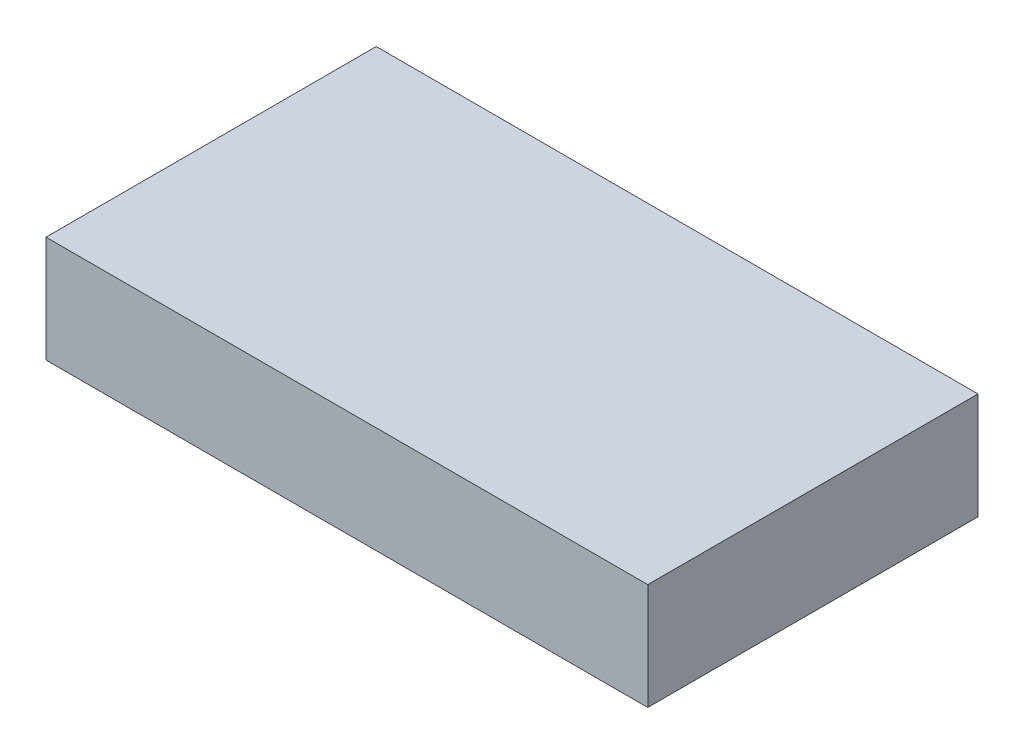
ISO-10303-21;
HEADER;
FILE_DESCRIPTION(('STEP AP214'),'2;1');
FILE_NAME('part.step','',(''),(''),'','','');
FILE_SCHEMA(('AUTOMOTIVE_DESIGN { 1 0 10303 214 1 1 1 1 }'));
ENDSEC;
DATA;
#1=APPLICATION_CONTEXT('core data for automotive mechanical design processes');
#2=APPLICATION_PROTOCOL_DEFINITION('international standard','automotive_design',2000,#1);
#3=PRODUCT_CONTEXT('',#1,'mechanical');
#4=PRODUCT('Part','Part','',(#3));
#5=PRODUCT_RELATED_PRODUCT_CATEGORY('part','',(#4));
#6=PRODUCT_DEFINITION_FORMATION('','',#4);
#7=PRODUCT_DEFINITION_CONTEXT('part definition',#1,'design');
#8=PRODUCT_DEFINITION('design','',#6,#7);
#9=PRODUCT_DEFINITION_SHAPE('','',#8);
#10=(LENGTH_UNIT() NAMED_UNIT(*) SI_UNIT(.MILLI.,.METRE.));
#11=(NAMED_UNIT(*) PLANE_ANGLE_UNIT() SI_UNIT($,.RADIAN.));
#12=(NAMED_UNIT(*) SI_UNIT($,.STERADIAN.) SOLID_ANGLE_UNIT());
#13=UNCERTAINTY_MEASURE_WITH_UNIT(LENGTH_MEASURE(1.E-05),#10,'distance_accuracy_value','');
#14=(GEOMETRIC_REPRESENTATION_CONTEXT(3) GLOBAL_UNCERTAINTY_ASSIGNED_CONTEXT((#13)) GLOBAL_UNIT_ASSIGNED_CONTEXT((#10,
#11,#12)) REPRESENTATION_CONTEXT('',''));
#15=CARTESIAN_POINT('',(0.,0.,0.));
#16=DIRECTION('',(0.,0.,1.));
#17=DIRECTION('',(1.,0.,0.));
#18=AXIS2_PLACEMENT_3D('',#15,#16,#17);
#19=CARTESIAN_POINT('',(-20.5,7.25,12.813421197899));
#20=DIRECTION('',(1.,0.,0.));
#21=DIRECTION('',(0.,0.,-1.));
#22=AXIS2_PLACEMENT_3D('',#19,#20,#21);
#23=PLANE('',#22);
#24=DIRECTION('',(0.,0.,1.));
#25=VECTOR('',#24,1.);
#26=CARTESIAN_POINT('',(-20.5,0.,12.813421197899));
#27=LINE('',#26,#25);
#28=CARTESIAN_POINT('',(-20.5,0.,-9.68657880210102));
#29=VERTEX_POINT('',#28);
#30=CARTESIAN_POINT('',(-20.5,0.,12.813421197899));
#31=VERTEX_POINT('',#30);
#32=EDGE_CURVE('E105',#29,#31,#27,.T.);
#33=ORIENTED_EDGE('',*,*,#32,.T.);
#34=DIRECTION('',(0.,-1.,0.));
#35=VECTOR('',#34,1.);
#36=CARTESIAN_POINT('',(-20.5,7.25,12.813421197899));
#37=LINE('',#36,#35);
#38=CARTESIAN_POINT('',(-20.5,7.25,12.813421197899));
#39=VERTEX_POINT('',#38);
#40=EDGE_CURVE('E11',#39,#31,#37,.T.);
#41=ORIENTED_EDGE('',*,*,#40,.F.);
#42=DIRECTION('',(0.,0.,1.));
#43=VECTOR('',#42,1.);
#44=CARTESIAN_POINT('',(-20.5,7.25,12.813421197899));
#45=LINE('',#44,#43);
#46=CARTESIAN_POINT('',(-20.5,7.25,-9.68657880210102));
#47=VERTEX_POINT('',#46);
#48=EDGE_CURVE('E89',#47,#39,#45,.T.);
#49=ORIENTED_EDGE('',*,*,#48,.F.);
#50=DIRECTION('',(0.,-1.,0.));
#51=VECTOR('',#50,1.);
#52=CARTESIAN_POINT('',(-20.5,7.25,-9.68657880210102));
#53=LINE('',#52,#51);
#54=EDGE_CURVE('E97',#47,#29,#53,.T.);
#55=ORIENTED_EDGE('',*,*,#54,.T.);
#56=EDGE_LOOP('',(#33,#41,#49,#55));
#57=FACE_BOUND('',#56,.T.);
#58=ADVANCED_FACE('F39',(#57),#23,.F.);
#59=CARTESIAN_POINT('',(-20.5,7.25,12.813421197899));
#60=DIRECTION('',(0.,0.,-1.));
#61=DIRECTION('',(-1.,0.,0.));
#62=AXIS2_PLACEMENT_3D('',#59,#60,#61);
#63=PLANE('',#62);
#64=DIRECTION('',(1.,0.,0.));
#65=VECTOR('',#64,1.);
#66=CARTESIAN_POINT('',(-20.5,0.,12.813421197899));
#67=LINE('',#66,#65);
#68=CARTESIAN_POINT('',(20.5,0.,12.813421197899));
#69=VERTEX_POINT('',#68);
#70=EDGE_CURVE('E92',#31,#69,#67,.T.);
#71=ORIENTED_EDGE('',*,*,#70,.T.);
#72=DIRECTION('',(0.,-1.,0.));
#73=VECTOR('',#72,1.);
#74=CARTESIAN_POINT('',(20.5,7.25,12.813421197899));
#75=LINE('',#74,#73);
#76=CARTESIAN_POINT('',(20.5,7.25,12.813421197899));
#77=VERTEX_POINT('',#76);
#78=EDGE_CURVE('E50',#77,#69,#75,.T.);
#79=ORIENTED_EDGE('',*,*,#78,.F.);
#80=DIRECTION('',(1.,0.,0.));
#81=VECTOR('',#80,1.);
#82=CARTESIAN_POINT('',(-20.5,7.25,12.813421197899));
#83=LINE('',#82,#81);
#84=EDGE_CURVE('E82',#39,#77,#83,.T.);
#85=ORIENTED_EDGE('',*,*,#84,.F.);
#86=ORIENTED_EDGE('',*,*,#40,.T.);
#87=EDGE_LOOP('',(#71,#79,#85,#86));
#88=FACE_BOUND('',#87,.T.);
#89=ADVANCED_FACE('F93',(#88),#63,.F.);
#90=CARTESIAN_POINT('',(20.5,7.25,12.813421197899));
#91=DIRECTION('',(-1.,0.,0.));
#92=DIRECTION('',(0.,0.,1.));
#93=AXIS2_PLACEMENT_3D('',#90,#91,#92);
#94=PLANE('',#93);
#95=DIRECTION('',(0.,0.,-1.));
#96=VECTOR('',#95,1.);
#97=CARTESIAN_POINT('',(20.5,0.,12.813421197899));
#98=LINE('',#97,#96);
#99=CARTESIAN_POINT('',(20.5,0.,-9.68657880210102));
#100=VERTEX_POINT('',#99);
#101=EDGE_CURVE('E72',#69,#100,#98,.T.);
#102=ORIENTED_EDGE('',*,*,#101,.T.);
#103=DIRECTION('',(0.,-1.,0.));
#104=VECTOR('',#103,1.);
#105=CARTESIAN_POINT('',(20.5,7.25,-9.68657880210102));
#106=LINE('',#105,#104);
#107=CARTESIAN_POINT('',(20.5,7.25,-9.68657880210102));
#108=VERTEX_POINT('',#107);
#109=EDGE_CURVE('E94',#108,#100,#106,.T.);
#110=ORIENTED_EDGE('',*,*,#109,.F.);
#111=DIRECTION('',(0.,0.,-1.));
#112=VECTOR('',#111,1.);
#113=CARTESIAN_POINT('',(20.5,7.25,12.813421197899));
#114=LINE('',#113,#112);
#115=EDGE_CURVE('E88',#77,#108,#114,.T.);
#116=ORIENTED_EDGE('',*,*,#115,.F.);
#117=ORIENTED_EDGE('',*,*,#78,.T.);
#118=EDGE_LOOP('',(#102,#110,#116,#117));
#119=FACE_BOUND('',#118,.T.);
#120=ADVANCED_FACE('F96',(#119),#94,.F.);
#121=CARTESIAN_POINT('',(20.5,7.25,-9.68657880210102));
#122=DIRECTION('',(0.,0.,1.));
#123=DIRECTION('',(1.,0.,0.));
#124=AXIS2_PLACEMENT_3D('',#121,#122,#123);
#125=PLANE('',#124);
#126=DIRECTION('',(-1.,0.,0.));
#127=VECTOR('',#126,1.);
#128=CARTESIAN_POINT('',(20.5,0.,-9.68657880210102));
#129=LINE('',#128,#127);
#130=EDGE_CURVE('E76',#100,#29,#129,.T.);
#131=ORIENTED_EDGE('',*,*,#130,.T.);
#132=ORIENTED_EDGE('',*,*,#54,.F.);
#133=DIRECTION('',(-1.,0.,0.));
#134=VECTOR('',#133,1.);
#135=CARTESIAN_POINT('',(20.5,7.25,-9.68657880210102));
#136=LINE('',#135,#134);
#137=EDGE_CURVE('E54',#108,#47,#136,.T.);
#138=ORIENTED_EDGE('',*,*,#137,.F.);
#139=ORIENTED_EDGE('',*,*,#109,.T.);
#140=EDGE_LOOP('',(#131,#132,#138,#139));
#141=FACE_BOUND('',#140,.T.);
#142=ADVANCED_FACE('F108',(#141),#125,.F.);
#143=CARTESIAN_POINT('',(0.,7.25,0.));
#144=DIRECTION('',(0.,1.,0.));
#145=DIRECTION('',(0.,0.,1.));
#146=AXIS2_PLACEMENT_3D('',#143,#144,#145);
#147=PLANE('',#146);
#148=ORIENTED_EDGE('',*,*,#48,.T.);
#149=ORIENTED_EDGE('',*,*,#84,.T.);
#150=ORIENTED_EDGE('',*,*,#115,.T.);
#151=ORIENTED_EDGE('',*,*,#137,.T.);
#152=EDGE_LOOP('',(#148,#149,#150,#151));
#153=FACE_BOUND('',#152,.T.);
#154=ADVANCED_FACE('F86',(#153),#147,.T.);
#155=CARTESIAN_POINT('',(0.,0.,0.));
#156=DIRECTION('',(0.,1.,0.));
#157=DIRECTION('',(0.,0.,1.));
#158=AXIS2_PLACEMENT_3D('',#155,#156,#157);
#159=PLANE('',#158);
#160=ORIENTED_EDGE('',*,*,#32,.F.);
#161=ORIENTED_EDGE('',*,*,#130,.F.);
#162=ORIENTED_EDGE('',*,*,#101,.F.);
#163=ORIENTED_EDGE('',*,*,#70,.F.);
#164=EDGE_LOOP('',(#160,#161,#162,#163));
#165=FACE_BOUND('',#164,.T.);
#166=ADVANCED_FACE('F115',(#165),#159,.F.);
#167=CLOSED_SHELL('',(#58,#89,#120,#142,#154,#166));
#168=MANIFOLD_SOLID_BREP('B2',#167);
#169=ADVANCED_BREP_SHAPE_REPRESENTATION('',(#18,#168),#14);
#170=SHAPE_DEFINITION_REPRESENTATION(#9,#169);
ENDSEC;
END-ISO-10303-21;
